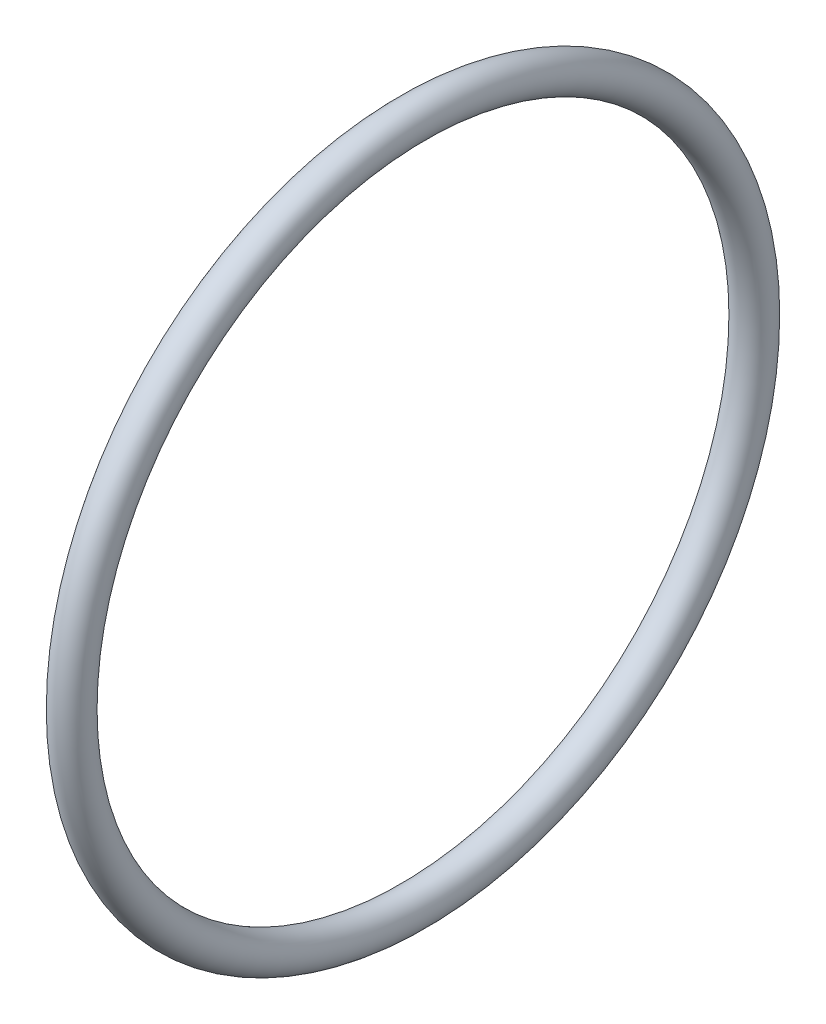
ISO-10303-21;
HEADER;
FILE_DESCRIPTION(('STEP AP214'),'2;1');
FILE_NAME('part.step','',(''),(''),'','','');
FILE_SCHEMA(('AUTOMOTIVE_DESIGN { 1 0 10303 214 1 1 1 1 }'));
ENDSEC;
DATA;
#1=APPLICATION_CONTEXT('core data for automotive mechanical design processes');
#2=APPLICATION_PROTOCOL_DEFINITION('international standard','automotive_design',2000,#1);
#3=PRODUCT_CONTEXT('',#1,'mechanical');
#4=PRODUCT('Part','Part','',(#3));
#5=PRODUCT_RELATED_PRODUCT_CATEGORY('part','',(#4));
#6=PRODUCT_DEFINITION_FORMATION('','',#4);
#7=PRODUCT_DEFINITION_CONTEXT('part definition',#1,'design');
#8=PRODUCT_DEFINITION('design','',#6,#7);
#9=PRODUCT_DEFINITION_SHAPE('','',#8);
#10=(LENGTH_UNIT() NAMED_UNIT(*) SI_UNIT(.MILLI.,.METRE.));
#11=(NAMED_UNIT(*) PLANE_ANGLE_UNIT() SI_UNIT($,.RADIAN.));
#12=(NAMED_UNIT(*) SI_UNIT($,.STERADIAN.) SOLID_ANGLE_UNIT());
#13=UNCERTAINTY_MEASURE_WITH_UNIT(LENGTH_MEASURE(1.E-05),#10,'distance_accuracy_value','');
#14=(GEOMETRIC_REPRESENTATION_CONTEXT(3) GLOBAL_UNCERTAINTY_ASSIGNED_CONTEXT((#13)) GLOBAL_UNIT_ASSIGNED_CONTEXT((#10,
#11,#12)) REPRESENTATION_CONTEXT('',''));
#15=CARTESIAN_POINT('',(0.,0.,0.));
#16=DIRECTION('',(0.,0.,1.));
#17=DIRECTION('',(1.,0.,0.));
#18=AXIS2_PLACEMENT_3D('',#15,#16,#17);
#19=CARTESIAN_POINT('',(0.,-47.5,0.));
#20=DIRECTION('',(-1.,0.,0.));
#21=DIRECTION('',(0.,0.,1.));
#22=AXIS2_PLACEMENT_3D('',#19,#20,#21);
#23=TOROIDAL_SURFACE('',#22,47.5,2.5);
#24=CARTESIAN_POINT('',(0.,-47.5,50.));
#25=VERTEX_POINT('',#24);
#26=VERTEX_LOOP('',#25);
#27=FACE_BOUND('',#26,.T.);
#28=ADVANCED_FACE('F35',(#27),#23,.T.);
#29=CLOSED_SHELL('',(#28));
#30=MANIFOLD_SOLID_BREP('B2',#29);
#31=ADVANCED_BREP_SHAPE_REPRESENTATION('',(#18,#30),#14);
#32=SHAPE_DEFINITION_REPRESENTATION(#9,#31);
ENDSEC;
END-ISO-10303-21;
